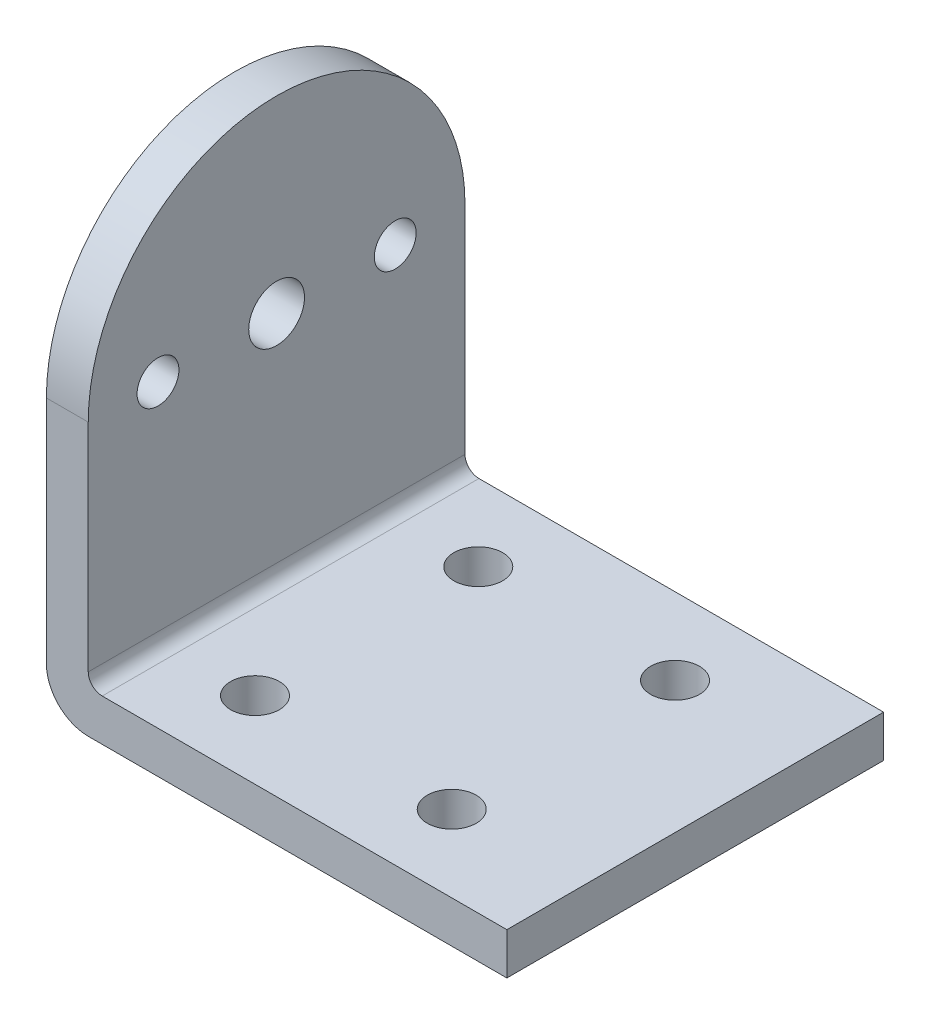
ISO-10303-21;
HEADER;
FILE_DESCRIPTION(('STEP AP214'),'2;1');
FILE_NAME('part.step','',(''),(''),'','','');
FILE_SCHEMA(('AUTOMOTIVE_DESIGN { 1 0 10303 214 1 1 1 1 }'));
ENDSEC;
DATA;
#1=APPLICATION_CONTEXT('core data for automotive mechanical design processes');
#2=APPLICATION_PROTOCOL_DEFINITION('international standard','automotive_design',2000,#1);
#3=PRODUCT_CONTEXT('',#1,'mechanical');
#4=PRODUCT('Part','Part','',(#3));
#5=PRODUCT_RELATED_PRODUCT_CATEGORY('part','',(#4));
#6=PRODUCT_DEFINITION_FORMATION('','',#4);
#7=PRODUCT_DEFINITION_CONTEXT('part definition',#1,'design');
#8=PRODUCT_DEFINITION('design','',#6,#7);
#9=PRODUCT_DEFINITION_SHAPE('','',#8);
#10=(LENGTH_UNIT() NAMED_UNIT(*) SI_UNIT(.MILLI.,.METRE.));
#11=(NAMED_UNIT(*) PLANE_ANGLE_UNIT() SI_UNIT($,.RADIAN.));
#12=(NAMED_UNIT(*) SI_UNIT($,.STERADIAN.) SOLID_ANGLE_UNIT());
#13=UNCERTAINTY_MEASURE_WITH_UNIT(LENGTH_MEASURE(1.E-05),#10,'distance_accuracy_value','');
#14=(GEOMETRIC_REPRESENTATION_CONTEXT(3) GLOBAL_UNCERTAINTY_ASSIGNED_CONTEXT((#13)) GLOBAL_UNIT_ASSIGNED_CONTEXT((#10,
#11,#12)) REPRESENTATION_CONTEXT('',''));
#15=CARTESIAN_POINT('',(0.,0.,0.));
#16=DIRECTION('',(0.,0.,1.));
#17=DIRECTION('',(1.,0.,0.));
#18=AXIS2_PLACEMENT_3D('',#15,#16,#17);
#19=CARTESIAN_POINT('',(3.,33.,27.));
#20=DIRECTION('',(-1.,0.,0.));
#21=DIRECTION('',(0.,-1.,0.));
#22=AXIS2_PLACEMENT_3D('',#19,#20,#21);
#23=PLANE('',#22);
#24=CARTESIAN_POINT('',(3.,19.5,13.5));
#25=DIRECTION('',(-1.,0.,0.));
#26=DIRECTION('',(0.,0.,1.));
#27=AXIS2_PLACEMENT_3D('',#24,#25,#26);
#28=CIRCLE('',#27,2.);
#29=CARTESIAN_POINT('',(3.,19.5,15.5));
#30=VERTEX_POINT('',#29);
#31=EDGE_CURVE('E406',#30,#30,#28,.T.);
#32=ORIENTED_EDGE('',*,*,#31,.T.);
#33=EDGE_LOOP('',(#32));
#34=FACE_BOUND('',#33,.T.);
#35=DIRECTION('',(0.,1.,0.));
#36=VECTOR('',#35,1.);
#37=CARTESIAN_POINT('',(3.,33.,0.));
#38=LINE('',#37,#36);
#39=CARTESIAN_POINT('',(3.,4.00000000000001,0.));
#40=VERTEX_POINT('',#39);
#41=CARTESIAN_POINT('',(3.,19.5,0.));
#42=VERTEX_POINT('',#41);
#43=EDGE_CURVE('E116',#40,#42,#38,.T.);
#44=ORIENTED_EDGE('',*,*,#43,.T.);
#45=CARTESIAN_POINT('',(3.,19.5,13.5));
#46=DIRECTION('',(-1.,0.,0.));
#47=DIRECTION('',(0.,0.,1.));
#48=AXIS2_PLACEMENT_3D('',#45,#46,#47);
#49=CIRCLE('',#48,13.5);
#50=CARTESIAN_POINT('',(3.,19.5,27.));
#51=VERTEX_POINT('',#50);
#52=EDGE_CURVE('E101',#51,#42,#49,.T.);
#53=ORIENTED_EDGE('',*,*,#52,.F.);
#54=DIRECTION('',(0.,1.,0.));
#55=VECTOR('',#54,1.);
#56=CARTESIAN_POINT('',(3.,33.,27.));
#57=LINE('',#56,#55);
#58=CARTESIAN_POINT('',(3.,4.00000000000001,27.));
#59=VERTEX_POINT('',#58);
#60=EDGE_CURVE('E191',#59,#51,#57,.T.);
#61=ORIENTED_EDGE('',*,*,#60,.F.);
#62=DIRECTION('',(0.,0.,-1.));
#63=VECTOR('',#62,1.);
#64=CARTESIAN_POINT('',(3.,4.,0.));
#65=LINE('',#64,#63);
#66=EDGE_CURVE('E125',#59,#40,#65,.T.);
#67=ORIENTED_EDGE('',*,*,#66,.T.);
#68=EDGE_LOOP('',(#44,#53,#61,#67));
#69=FACE_BOUND('',#68,.T.);
#70=CARTESIAN_POINT('',(3.,19.5,22.));
#71=DIRECTION('',(-1.,0.,0.));
#72=DIRECTION('',(0.,0.,1.));
#73=AXIS2_PLACEMENT_3D('',#70,#71,#72);
#74=CIRCLE('',#73,1.5);
#75=CARTESIAN_POINT('',(3.,19.5,23.5));
#76=VERTEX_POINT('',#75);
#77=EDGE_CURVE('E423',#76,#76,#74,.F.);
#78=ORIENTED_EDGE('',*,*,#77,.F.);
#79=EDGE_LOOP('',(#78));
#80=FACE_BOUND('',#79,.T.);
#81=CARTESIAN_POINT('',(3.,19.5,5.));
#82=DIRECTION('',(-1.,0.,0.));
#83=DIRECTION('',(0.,0.,1.));
#84=AXIS2_PLACEMENT_3D('',#81,#82,#83);
#85=CIRCLE('',#84,1.5);
#86=CARTESIAN_POINT('',(3.,19.5,6.5));
#87=VERTEX_POINT('',#86);
#88=EDGE_CURVE('E120',#87,#87,#85,.T.);
#89=ORIENTED_EDGE('',*,*,#88,.T.);
#90=EDGE_LOOP('',(#89));
#91=FACE_BOUND('',#90,.T.);
#92=ADVANCED_FACE('F38',(#34,#69,#80,#91),#23,.F.);
#93=CARTESIAN_POINT('',(0.,0.,27.));
#94=DIRECTION('',(1.,0.,0.));
#95=DIRECTION('',(0.,0.,-1.));
#96=AXIS2_PLACEMENT_3D('',#93,#94,#95);
#97=PLANE('',#96);
#98=CARTESIAN_POINT('',(0.,19.5,13.5));
#99=DIRECTION('',(-1.,0.,0.));
#100=DIRECTION('',(0.,0.,1.));
#101=AXIS2_PLACEMENT_3D('',#98,#99,#100);
#102=CIRCLE('',#101,2.);
#103=CARTESIAN_POINT('',(0.,19.5,15.5));
#104=VERTEX_POINT('',#103);
#105=EDGE_CURVE('E409',#104,#104,#102,.T.);
#106=ORIENTED_EDGE('',*,*,#105,.F.);
#107=EDGE_LOOP('',(#106));
#108=FACE_BOUND('',#107,.T.);
#109=CARTESIAN_POINT('',(0.,19.5,13.5));
#110=DIRECTION('',(-1.,0.,0.));
#111=DIRECTION('',(0.,0.,1.));
#112=AXIS2_PLACEMENT_3D('',#109,#110,#111);
#113=CIRCLE('',#112,13.5);
#114=CARTESIAN_POINT('',(0.,19.5,27.));
#115=VERTEX_POINT('',#114);
#116=CARTESIAN_POINT('',(0.,19.5,0.));
#117=VERTEX_POINT('',#116);
#118=EDGE_CURVE('E54',#115,#117,#113,.T.);
#119=ORIENTED_EDGE('',*,*,#118,.T.);
#120=DIRECTION('',(0.,-1.,0.));
#121=VECTOR('',#120,1.);
#122=CARTESIAN_POINT('',(0.,0.,0.));
#123=LINE('',#122,#121);
#124=CARTESIAN_POINT('',(0.,3.,0.));
#125=VERTEX_POINT('',#124);
#126=EDGE_CURVE('E118',#117,#125,#123,.T.);
#127=ORIENTED_EDGE('',*,*,#126,.T.);
#128=DIRECTION('',(0.,0.,-1.));
#129=VECTOR('',#128,1.);
#130=CARTESIAN_POINT('',(0.,3.,27.));
#131=LINE('',#130,#129);
#132=CARTESIAN_POINT('',(0.,3.,27.));
#133=VERTEX_POINT('',#132);
#134=EDGE_CURVE('E47',#125,#133,#131,.F.);
#135=ORIENTED_EDGE('',*,*,#134,.T.);
#136=DIRECTION('',(0.,-1.,0.));
#137=VECTOR('',#136,1.);
#138=CARTESIAN_POINT('',(0.,0.,27.));
#139=LINE('',#138,#137);
#140=EDGE_CURVE('E60',#115,#133,#139,.T.);
#141=ORIENTED_EDGE('',*,*,#140,.F.);
#142=EDGE_LOOP('',(#119,#127,#135,#141));
#143=FACE_BOUND('',#142,.T.);
#144=CARTESIAN_POINT('',(0.,19.5,22.));
#145=DIRECTION('',(-1.,0.,0.));
#146=DIRECTION('',(0.,0.,1.));
#147=AXIS2_PLACEMENT_3D('',#144,#145,#146);
#148=CIRCLE('',#147,1.5);
#149=CARTESIAN_POINT('',(0.,19.5,23.5));
#150=VERTEX_POINT('',#149);
#151=EDGE_CURVE('E413',#150,#150,#148,.F.);
#152=ORIENTED_EDGE('',*,*,#151,.T.);
#153=EDGE_LOOP('',(#152));
#154=FACE_BOUND('',#153,.T.);
#155=CARTESIAN_POINT('',(0.,19.5,5.));
#156=DIRECTION('',(-1.,0.,0.));
#157=DIRECTION('',(0.,0.,1.));
#158=AXIS2_PLACEMENT_3D('',#155,#156,#157);
#159=CIRCLE('',#158,1.5);
#160=CARTESIAN_POINT('',(0.,19.5,6.5));
#161=VERTEX_POINT('',#160);
#162=EDGE_CURVE('E419',#161,#161,#159,.T.);
#163=ORIENTED_EDGE('',*,*,#162,.F.);
#164=EDGE_LOOP('',(#163));
#165=FACE_BOUND('',#164,.T.);
#166=ADVANCED_FACE('F167',(#108,#143,#154,#165),#97,.F.);
#167=CARTESIAN_POINT('',(33.,0.,27.));
#168=DIRECTION('',(0.,1.,0.));
#169=DIRECTION('',(-1.,0.,0.));
#170=AXIS2_PLACEMENT_3D('',#167,#168,#169);
#171=PLANE('',#170);
#172=CARTESIAN_POINT('',(9.45,0.,5.5));
#173=DIRECTION('',(0.,-1.,0.));
#174=DIRECTION('',(-1.,0.,0.));
#175=AXIS2_PLACEMENT_3D('',#172,#173,#174);
#176=CIRCLE('',#175,1.75);
#177=CARTESIAN_POINT('',(7.7,0.,5.5));
#178=VERTEX_POINT('',#177);
#179=EDGE_CURVE('E213',#178,#178,#176,.T.);
#180=ORIENTED_EDGE('',*,*,#179,.F.);
#181=EDGE_LOOP('',(#180));
#182=FACE_BOUND('',#181,.T.);
#183=CARTESIAN_POINT('',(23.55,0.,5.5));
#184=DIRECTION('',(0.,-1.,0.));
#185=DIRECTION('',(-1.,0.,0.));
#186=AXIS2_PLACEMENT_3D('',#183,#184,#185);
#187=CIRCLE('',#186,1.75);
#188=CARTESIAN_POINT('',(21.8,0.,5.5));
#189=VERTEX_POINT('',#188);
#190=EDGE_CURVE('E233',#189,#189,#187,.T.);
#191=ORIENTED_EDGE('',*,*,#190,.F.);
#192=EDGE_LOOP('',(#191));
#193=FACE_BOUND('',#192,.T.);
#194=CARTESIAN_POINT('',(23.55,0.,21.5));
#195=DIRECTION('',(0.,-1.,0.));
#196=DIRECTION('',(1.,0.,0.));
#197=AXIS2_PLACEMENT_3D('',#194,#195,#196);
#198=CIRCLE('',#197,1.75);
#199=CARTESIAN_POINT('',(25.3,0.,21.5));
#200=VERTEX_POINT('',#199);
#201=EDGE_CURVE('E225',#200,#200,#198,.T.);
#202=ORIENTED_EDGE('',*,*,#201,.F.);
#203=EDGE_LOOP('',(#202));
#204=FACE_BOUND('',#203,.T.);
#205=CARTESIAN_POINT('',(9.45,0.,21.5));
#206=DIRECTION('',(0.,-1.,0.));
#207=DIRECTION('',(1.,0.,0.));
#208=AXIS2_PLACEMENT_3D('',#205,#206,#207);
#209=CIRCLE('',#208,1.75);
#210=CARTESIAN_POINT('',(11.2,0.,21.5));
#211=VERTEX_POINT('',#210);
#212=EDGE_CURVE('E185',#211,#211,#209,.T.);
#213=ORIENTED_EDGE('',*,*,#212,.F.);
#214=EDGE_LOOP('',(#213));
#215=FACE_BOUND('',#214,.T.);
#216=DIRECTION('',(1.,0.,0.));
#217=VECTOR('',#216,1.);
#218=CARTESIAN_POINT('',(33.,0.,27.));
#219=LINE('',#218,#217);
#220=CARTESIAN_POINT('',(3.,0.,27.));
#221=VERTEX_POINT('',#220);
#222=CARTESIAN_POINT('',(33.,0.,27.));
#223=VERTEX_POINT('',#222);
#224=EDGE_CURVE('E131',#221,#223,#219,.T.);
#225=ORIENTED_EDGE('',*,*,#224,.F.);
#226=DIRECTION('',(0.,0.,-1.));
#227=VECTOR('',#226,1.);
#228=CARTESIAN_POINT('',(3.,0.,27.));
#229=LINE('',#228,#227);
#230=CARTESIAN_POINT('',(3.,0.,0.));
#231=VERTEX_POINT('',#230);
#232=EDGE_CURVE('E157',#221,#231,#229,.T.);
#233=ORIENTED_EDGE('',*,*,#232,.T.);
#234=DIRECTION('',(1.,0.,0.));
#235=VECTOR('',#234,1.);
#236=CARTESIAN_POINT('',(33.,0.,0.));
#237=LINE('',#236,#235);
#238=CARTESIAN_POINT('',(33.,0.,0.));
#239=VERTEX_POINT('',#238);
#240=EDGE_CURVE('E196',#231,#239,#237,.T.);
#241=ORIENTED_EDGE('',*,*,#240,.T.);
#242=DIRECTION('',(0.,0.,-1.));
#243=VECTOR('',#242,1.);
#244=CARTESIAN_POINT('',(33.,0.,27.));
#245=LINE('',#244,#243);
#246=EDGE_CURVE('E142',#223,#239,#245,.T.);
#247=ORIENTED_EDGE('',*,*,#246,.F.);
#248=EDGE_LOOP('',(#225,#233,#241,#247));
#249=FACE_BOUND('',#248,.T.);
#250=ADVANCED_FACE('F176',(#182,#193,#204,#215,#249),#171,.F.);
#251=CARTESIAN_POINT('',(33.,3.,27.));
#252=DIRECTION('',(-1.,0.,0.));
#253=DIRECTION('',(0.,0.,1.));
#254=AXIS2_PLACEMENT_3D('',#251,#252,#253);
#255=PLANE('',#254);
#256=DIRECTION('',(0.,1.,0.));
#257=VECTOR('',#256,1.);
#258=CARTESIAN_POINT('',(33.,3.,0.));
#259=LINE('',#258,#257);
#260=CARTESIAN_POINT('',(33.,3.,0.));
#261=VERTEX_POINT('',#260);
#262=EDGE_CURVE('E134',#239,#261,#259,.T.);
#263=ORIENTED_EDGE('',*,*,#262,.T.);
#264=DIRECTION('',(0.,0.,-1.));
#265=VECTOR('',#264,1.);
#266=CARTESIAN_POINT('',(33.,3.,27.));
#267=LINE('',#266,#265);
#268=CARTESIAN_POINT('',(33.,3.,27.));
#269=VERTEX_POINT('',#268);
#270=EDGE_CURVE('E138',#269,#261,#267,.T.);
#271=ORIENTED_EDGE('',*,*,#270,.F.);
#272=DIRECTION('',(0.,1.,0.));
#273=VECTOR('',#272,1.);
#274=CARTESIAN_POINT('',(33.,3.,27.));
#275=LINE('',#274,#273);
#276=EDGE_CURVE('E179',#223,#269,#275,.T.);
#277=ORIENTED_EDGE('',*,*,#276,.F.);
#278=ORIENTED_EDGE('',*,*,#246,.T.);
#279=EDGE_LOOP('',(#263,#271,#277,#278));
#280=FACE_BOUND('',#279,.T.);
#281=ADVANCED_FACE('F203',(#280),#255,.F.);
#282=CARTESIAN_POINT('',(3.,3.,27.));
#283=DIRECTION('',(0.,-1.,0.));
#284=DIRECTION('',(0.,0.,-1.));
#285=AXIS2_PLACEMENT_3D('',#282,#283,#284);
#286=PLANE('',#285);
#287=CARTESIAN_POINT('',(9.45,3.,5.5));
#288=DIRECTION('',(0.,-1.,0.));
#289=DIRECTION('',(-1.,0.,0.));
#290=AXIS2_PLACEMENT_3D('',#287,#288,#289);
#291=CIRCLE('',#290,1.75);
#292=CARTESIAN_POINT('',(7.7,3.,5.5));
#293=VERTEX_POINT('',#292);
#294=EDGE_CURVE('E217',#293,#293,#291,.T.);
#295=ORIENTED_EDGE('',*,*,#294,.T.);
#296=EDGE_LOOP('',(#295));
#297=FACE_BOUND('',#296,.T.);
#298=CARTESIAN_POINT('',(23.55,3.,5.5));
#299=DIRECTION('',(0.,-1.,0.));
#300=DIRECTION('',(-1.,0.,0.));
#301=AXIS2_PLACEMENT_3D('',#298,#299,#300);
#302=CIRCLE('',#301,1.75);
#303=CARTESIAN_POINT('',(21.8,3.,5.5));
#304=VERTEX_POINT('',#303);
#305=EDGE_CURVE('E229',#304,#304,#302,.T.);
#306=ORIENTED_EDGE('',*,*,#305,.T.);
#307=EDGE_LOOP('',(#306));
#308=FACE_BOUND('',#307,.T.);
#309=CARTESIAN_POINT('',(23.55,3.,21.5));
#310=DIRECTION('',(0.,-1.,0.));
#311=DIRECTION('',(1.,0.,0.));
#312=AXIS2_PLACEMENT_3D('',#309,#310,#311);
#313=CIRCLE('',#312,1.75);
#314=CARTESIAN_POINT('',(25.3,3.,21.5));
#315=VERTEX_POINT('',#314);
#316=EDGE_CURVE('E221',#315,#315,#313,.T.);
#317=ORIENTED_EDGE('',*,*,#316,.T.);
#318=EDGE_LOOP('',(#317));
#319=FACE_BOUND('',#318,.T.);
#320=CARTESIAN_POINT('',(9.45,3.,21.5));
#321=DIRECTION('',(0.,-1.,0.));
#322=DIRECTION('',(1.,0.,0.));
#323=AXIS2_PLACEMENT_3D('',#320,#321,#322);
#324=CIRCLE('',#323,1.75);
#325=CARTESIAN_POINT('',(11.2,3.,21.5));
#326=VERTEX_POINT('',#325);
#327=EDGE_CURVE('E198',#326,#326,#324,.T.);
#328=ORIENTED_EDGE('',*,*,#327,.T.);
#329=EDGE_LOOP('',(#328));
#330=FACE_BOUND('',#329,.T.);
#331=DIRECTION('',(-1.,0.,0.));
#332=VECTOR('',#331,1.);
#333=CARTESIAN_POINT('',(3.,3.,0.));
#334=LINE('',#333,#332);
#335=CARTESIAN_POINT('',(4.,3.,0.));
#336=VERTEX_POINT('',#335);
#337=EDGE_CURVE('E127',#261,#336,#334,.T.);
#338=ORIENTED_EDGE('',*,*,#337,.T.);
#339=DIRECTION('',(0.,0.,-1.));
#340=VECTOR('',#339,1.);
#341=CARTESIAN_POINT('',(4.,3.,27.));
#342=LINE('',#341,#340);
#343=CARTESIAN_POINT('',(4.,3.,27.));
#344=VERTEX_POINT('',#343);
#345=EDGE_CURVE('E148',#336,#344,#342,.F.);
#346=ORIENTED_EDGE('',*,*,#345,.T.);
#347=DIRECTION('',(-1.,0.,0.));
#348=VECTOR('',#347,1.);
#349=CARTESIAN_POINT('',(3.,3.,27.));
#350=LINE('',#349,#348);
#351=EDGE_CURVE('E182',#269,#344,#350,.T.);
#352=ORIENTED_EDGE('',*,*,#351,.F.);
#353=ORIENTED_EDGE('',*,*,#270,.T.);
#354=EDGE_LOOP('',(#338,#346,#352,#353));
#355=FACE_BOUND('',#354,.T.);
#356=ADVANCED_FACE('F207',(#297,#308,#319,#330,#355),#286,.F.);
#357=CARTESIAN_POINT('',(0.,0.,27.));
#358=DIRECTION('',(0.,0.,-1.));
#359=DIRECTION('',(-1.,0.,0.));
#360=AXIS2_PLACEMENT_3D('',#357,#358,#359);
#361=PLANE('',#360);
#362=ORIENTED_EDGE('',*,*,#60,.T.);
#363=DIRECTION('',(-1.,0.,0.));
#364=VECTOR('',#363,1.);
#365=CARTESIAN_POINT('',(3.,19.5,27.));
#366=LINE('',#365,#364);
#367=EDGE_CURVE('E106',#51,#115,#366,.T.);
#368=ORIENTED_EDGE('',*,*,#367,.T.);
#369=ORIENTED_EDGE('',*,*,#140,.T.);
#370=CARTESIAN_POINT('',(3.,3.,27.));
#371=DIRECTION('',(0.,0.,-1.));
#372=DIRECTION('',(-1.,0.,0.));
#373=AXIS2_PLACEMENT_3D('',#370,#371,#372);
#374=CIRCLE('',#373,3.);
#375=EDGE_CURVE('E11',#133,#221,#374,.F.);
#376=ORIENTED_EDGE('',*,*,#375,.T.);
#377=ORIENTED_EDGE('',*,*,#224,.T.);
#378=ORIENTED_EDGE('',*,*,#276,.T.);
#379=ORIENTED_EDGE('',*,*,#351,.T.);
#380=CARTESIAN_POINT('',(4.,4.,27.));
#381=DIRECTION('',(0.,0.,-1.));
#382=DIRECTION('',(-1.,0.,0.));
#383=AXIS2_PLACEMENT_3D('',#380,#381,#382);
#384=CIRCLE('',#383,1.);
#385=EDGE_CURVE('E154',#344,#59,#384,.T.);
#386=ORIENTED_EDGE('',*,*,#385,.T.);
#387=EDGE_LOOP('',(#362,#368,#369,#376,#377,#378,#379,#386));
#388=FACE_BOUND('',#387,.T.);
#389=ADVANCED_FACE('F172',(#388),#361,.F.);
#390=CARTESIAN_POINT('',(0.,0.,0.));
#391=DIRECTION('',(0.,0.,-1.));
#392=DIRECTION('',(-1.,0.,0.));
#393=AXIS2_PLACEMENT_3D('',#390,#391,#392);
#394=PLANE('',#393);
#395=DIRECTION('',(-1.,0.,0.));
#396=VECTOR('',#395,1.);
#397=CARTESIAN_POINT('',(3.,19.5,0.));
#398=LINE('',#397,#396);
#399=EDGE_CURVE('E104',#42,#117,#398,.T.);
#400=ORIENTED_EDGE('',*,*,#399,.F.);
#401=ORIENTED_EDGE('',*,*,#43,.F.);
#402=CARTESIAN_POINT('',(4.,4.,0.));
#403=DIRECTION('',(0.,0.,-1.));
#404=DIRECTION('',(-1.,0.,0.));
#405=AXIS2_PLACEMENT_3D('',#402,#403,#404);
#406=CIRCLE('',#405,1.);
#407=EDGE_CURVE('E151',#40,#336,#406,.F.);
#408=ORIENTED_EDGE('',*,*,#407,.T.);
#409=ORIENTED_EDGE('',*,*,#337,.F.);
#410=ORIENTED_EDGE('',*,*,#262,.F.);
#411=ORIENTED_EDGE('',*,*,#240,.F.);
#412=CARTESIAN_POINT('',(3.,3.,0.));
#413=DIRECTION('',(0.,0.,-1.));
#414=DIRECTION('',(-1.,0.,0.));
#415=AXIS2_PLACEMENT_3D('',#412,#413,#414);
#416=CIRCLE('',#415,3.);
#417=EDGE_CURVE('E161',#231,#125,#416,.T.);
#418=ORIENTED_EDGE('',*,*,#417,.T.);
#419=ORIENTED_EDGE('',*,*,#126,.F.);
#420=EDGE_LOOP('',(#400,#401,#408,#409,#410,#411,#418,#419));
#421=FACE_BOUND('',#420,.T.);
#422=ADVANCED_FACE('F115',(#421),#394,.T.);
#423=CARTESIAN_POINT('',(4.,4.,27.));
#424=DIRECTION('',(0.,0.,1.));
#425=DIRECTION('',(1.,0.,0.));
#426=AXIS2_PLACEMENT_3D('',#423,#424,#425);
#427=CYLINDRICAL_SURFACE('',#426,1.);
#428=ORIENTED_EDGE('',*,*,#385,.F.);
#429=ORIENTED_EDGE('',*,*,#345,.F.);
#430=ORIENTED_EDGE('',*,*,#407,.F.);
#431=ORIENTED_EDGE('',*,*,#66,.F.);
#432=EDGE_LOOP('',(#428,#429,#430,#431));
#433=FACE_BOUND('',#432,.T.);
#434=ADVANCED_FACE('F211',(#433),#427,.F.);
#435=CARTESIAN_POINT('',(9.45,3.,21.5));
#436=DIRECTION('',(0.,-1.,0.));
#437=DIRECTION('',(1.,0.,0.));
#438=AXIS2_PLACEMENT_3D('',#435,#436,#437);
#439=CYLINDRICAL_SURFACE('',#438,1.75);
#440=ORIENTED_EDGE('',*,*,#327,.F.);
#441=EDGE_LOOP('',(#440));
#442=FACE_BOUND('',#441,.T.);
#443=ORIENTED_EDGE('',*,*,#212,.T.);
#444=EDGE_LOOP('',(#443));
#445=FACE_BOUND('',#444,.T.);
#446=ADVANCED_FACE('F247',(#442,#445),#439,.F.);
#447=CARTESIAN_POINT('',(23.55,3.,21.5));
#448=DIRECTION('',(0.,-1.,0.));
#449=DIRECTION('',(1.,0.,0.));
#450=AXIS2_PLACEMENT_3D('',#447,#448,#449);
#451=CYLINDRICAL_SURFACE('',#450,1.75);
#452=ORIENTED_EDGE('',*,*,#316,.F.);
#453=EDGE_LOOP('',(#452));
#454=FACE_BOUND('',#453,.T.);
#455=ORIENTED_EDGE('',*,*,#201,.T.);
#456=EDGE_LOOP('',(#455));
#457=FACE_BOUND('',#456,.T.);
#458=ADVANCED_FACE('F281',(#454,#457),#451,.F.);
#459=CARTESIAN_POINT('',(23.55,3.,5.5));
#460=DIRECTION('',(0.,-1.,0.));
#461=DIRECTION('',(1.,0.,0.));
#462=AXIS2_PLACEMENT_3D('',#459,#460,#461);
#463=CYLINDRICAL_SURFACE('',#462,1.75);
#464=ORIENTED_EDGE('',*,*,#305,.F.);
#465=EDGE_LOOP('',(#464));
#466=FACE_BOUND('',#465,.T.);
#467=ORIENTED_EDGE('',*,*,#190,.T.);
#468=EDGE_LOOP('',(#467));
#469=FACE_BOUND('',#468,.T.);
#470=ADVANCED_FACE('F284',(#466,#469),#463,.F.);
#471=CARTESIAN_POINT('',(9.45,3.,5.5));
#472=DIRECTION('',(0.,-1.,0.));
#473=DIRECTION('',(1.,0.,0.));
#474=AXIS2_PLACEMENT_3D('',#471,#472,#473);
#475=CYLINDRICAL_SURFACE('',#474,1.75);
#476=ORIENTED_EDGE('',*,*,#294,.F.);
#477=EDGE_LOOP('',(#476));
#478=FACE_BOUND('',#477,.T.);
#479=ORIENTED_EDGE('',*,*,#179,.T.);
#480=EDGE_LOOP('',(#479));
#481=FACE_BOUND('',#480,.T.);
#482=ADVANCED_FACE('F292',(#478,#481),#475,.F.);
#483=CARTESIAN_POINT('',(3.,3.,27.));
#484=DIRECTION('',(0.,0.,-1.));
#485=DIRECTION('',(-1.,0.,0.));
#486=AXIS2_PLACEMENT_3D('',#483,#484,#485);
#487=CYLINDRICAL_SURFACE('',#486,3.);
#488=ORIENTED_EDGE('',*,*,#375,.F.);
#489=ORIENTED_EDGE('',*,*,#134,.F.);
#490=ORIENTED_EDGE('',*,*,#417,.F.);
#491=ORIENTED_EDGE('',*,*,#232,.F.);
#492=EDGE_LOOP('',(#488,#489,#490,#491));
#493=FACE_BOUND('',#492,.T.);
#494=ADVANCED_FACE('F40',(#493),#487,.T.);
#495=CARTESIAN_POINT('',(3.,19.5,13.5));
#496=DIRECTION('',(-1.,0.,0.));
#497=DIRECTION('',(0.,0.,1.));
#498=AXIS2_PLACEMENT_3D('',#495,#496,#497);
#499=CYLINDRICAL_SURFACE('',#498,13.5);
#500=ORIENTED_EDGE('',*,*,#118,.F.);
#501=ORIENTED_EDGE('',*,*,#367,.F.);
#502=ORIENTED_EDGE('',*,*,#52,.T.);
#503=ORIENTED_EDGE('',*,*,#399,.T.);
#504=EDGE_LOOP('',(#500,#501,#502,#503));
#505=FACE_BOUND('',#504,.T.);
#506=ADVANCED_FACE('F103',(#505),#499,.T.);
#507=CARTESIAN_POINT('',(3.,19.5,22.));
#508=DIRECTION('',(-1.,0.,0.));
#509=DIRECTION('',(0.,0.,1.));
#510=AXIS2_PLACEMENT_3D('',#507,#508,#509);
#511=CYLINDRICAL_SURFACE('',#510,1.5);
#512=ORIENTED_EDGE('',*,*,#77,.T.);
#513=EDGE_LOOP('',(#512));
#514=FACE_BOUND('',#513,.T.);
#515=ORIENTED_EDGE('',*,*,#151,.F.);
#516=EDGE_LOOP('',(#515));
#517=FACE_BOUND('',#516,.T.);
#518=ADVANCED_FACE('F363',(#514,#517),#511,.F.);
#519=CARTESIAN_POINT('',(3.,19.5,5.));
#520=DIRECTION('',(-1.,0.,0.));
#521=DIRECTION('',(0.,0.,1.));
#522=AXIS2_PLACEMENT_3D('',#519,#520,#521);
#523=CYLINDRICAL_SURFACE('',#522,1.5);
#524=ORIENTED_EDGE('',*,*,#88,.F.);
#525=EDGE_LOOP('',(#524));
#526=FACE_BOUND('',#525,.T.);
#527=ORIENTED_EDGE('',*,*,#162,.T.);
#528=EDGE_LOOP('',(#527));
#529=FACE_BOUND('',#528,.T.);
#530=ADVANCED_FACE('F372',(#526,#529),#523,.F.);
#531=CARTESIAN_POINT('',(3.,19.5,13.5));
#532=DIRECTION('',(-1.,0.,0.));
#533=DIRECTION('',(0.,0.,1.));
#534=AXIS2_PLACEMENT_3D('',#531,#532,#533);
#535=CYLINDRICAL_SURFACE('',#534,2.);
#536=ORIENTED_EDGE('',*,*,#31,.F.);
#537=EDGE_LOOP('',(#536));
#538=FACE_BOUND('',#537,.T.);
#539=ORIENTED_EDGE('',*,*,#105,.T.);
#540=EDGE_LOOP('',(#539));
#541=FACE_BOUND('',#540,.T.);
#542=ADVANCED_FACE('F381',(#538,#541),#535,.F.);
#543=CLOSED_SHELL('',(#92,#166,#250,#281,#356,#389,#422,#434,#446,#458,#470,#482,#494,#506,#518,
#530,#542));
#544=MANIFOLD_SOLID_BREP('B2',#543);
#545=ADVANCED_BREP_SHAPE_REPRESENTATION('',(#18,#544),#14);
#546=SHAPE_DEFINITION_REPRESENTATION(#9,#545);
ENDSEC;
END-ISO-10303-21;
